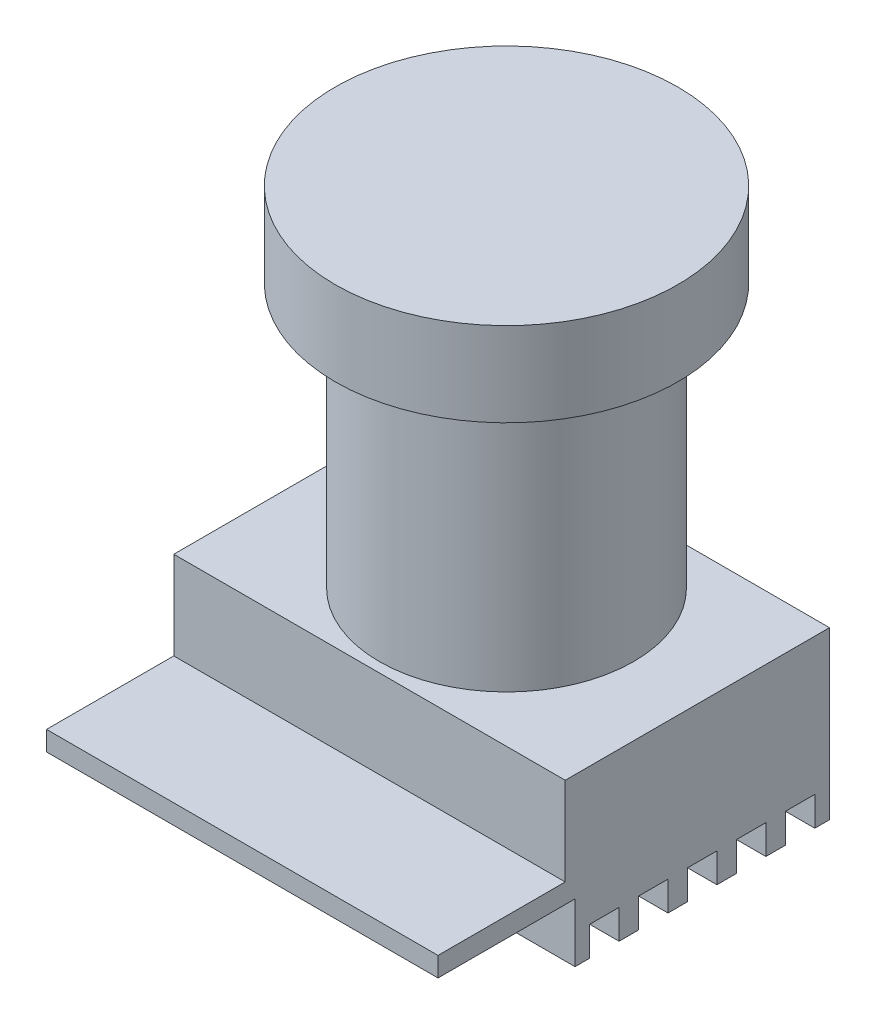
ISO-10303-21;
HEADER;
FILE_DESCRIPTION(('STEP AP214'),'2;1');
FILE_NAME('part.step','',(''),(''),'','','');
FILE_SCHEMA(('AUTOMOTIVE_DESIGN { 1 0 10303 214 1 1 1 1 }'));
ENDSEC;
DATA;
#1=APPLICATION_CONTEXT('core data for automotive mechanical design processes');
#2=APPLICATION_PROTOCOL_DEFINITION('international standard','automotive_design',2000,#1);
#3=PRODUCT_CONTEXT('',#1,'mechanical');
#4=PRODUCT('Part','Part','',(#3));
#5=PRODUCT_RELATED_PRODUCT_CATEGORY('part','',(#4));
#6=PRODUCT_DEFINITION_FORMATION('','',#4);
#7=PRODUCT_DEFINITION_CONTEXT('part definition',#1,'design');
#8=PRODUCT_DEFINITION('design','',#6,#7);
#9=PRODUCT_DEFINITION_SHAPE('','',#8);
#10=(LENGTH_UNIT() NAMED_UNIT(*) SI_UNIT(.MILLI.,.METRE.));
#11=(NAMED_UNIT(*) PLANE_ANGLE_UNIT() SI_UNIT($,.RADIAN.));
#12=(NAMED_UNIT(*) SI_UNIT($,.STERADIAN.) SOLID_ANGLE_UNIT());
#13=UNCERTAINTY_MEASURE_WITH_UNIT(LENGTH_MEASURE(1.E-05),#10,'distance_accuracy_value','');
#14=(GEOMETRIC_REPRESENTATION_CONTEXT(3) GLOBAL_UNCERTAINTY_ASSIGNED_CONTEXT((#13)) GLOBAL_UNIT_ASSIGNED_CONTEXT((#10,
#11,#12)) REPRESENTATION_CONTEXT('',''));
#15=CARTESIAN_POINT('',(0.,0.,0.));
#16=DIRECTION('',(0.,0.,1.));
#17=DIRECTION('',(1.,0.,0.));
#18=AXIS2_PLACEMENT_3D('',#15,#16,#17);
#19=CARTESIAN_POINT('',(0.,-3.,0.));
#20=DIRECTION('',(0.,1.,0.));
#21=DIRECTION('',(0.,0.,1.));
#22=AXIS2_PLACEMENT_3D('',#19,#20,#21);
#23=PLANE('',#22);
#24=DIRECTION('',(0.,0.,1.));
#25=VECTOR('',#24,1.);
#26=CARTESIAN_POINT('',(10.,-3.,-10.));
#27=LINE('',#26,#25);
#28=CARTESIAN_POINT('',(10.,-3.00000000000003,-7.75));
#29=VERTEX_POINT('',#28);
#30=CARTESIAN_POINT('',(10.,-3.00000000000002,-6.75));
#31=VERTEX_POINT('',#30);
#32=EDGE_CURVE('E395',#29,#31,#27,.T.);
#33=ORIENTED_EDGE('',*,*,#32,.T.);
#34=DIRECTION('',(-1.,0.,0.));
#35=VECTOR('',#34,1.);
#36=CARTESIAN_POINT('',(10.,-3.00000000000002,-6.75));
#37=LINE('',#36,#35);
#38=CARTESIAN_POINT('',(-10.,-3.00000000000002,-6.75));
#39=VERTEX_POINT('',#38);
#40=EDGE_CURVE('E316',#31,#39,#37,.T.);
#41=ORIENTED_EDGE('',*,*,#40,.T.);
#42=DIRECTION('',(0.,0.,-1.));
#43=VECTOR('',#42,1.);
#44=CARTESIAN_POINT('',(-10.,-3.,-10.));
#45=LINE('',#44,#43);
#46=CARTESIAN_POINT('',(-10.,-3.,-7.75));
#47=VERTEX_POINT('',#46);
#48=EDGE_CURVE('E500',#39,#47,#45,.T.);
#49=ORIENTED_EDGE('',*,*,#48,.T.);
#50=DIRECTION('',(-1.,0.,0.));
#51=VECTOR('',#50,1.);
#52=CARTESIAN_POINT('',(10.,-3.00000000000003,-7.75));
#53=LINE('',#52,#51);
#54=EDGE_CURVE('E56',#29,#47,#53,.T.);
#55=ORIENTED_EDGE('',*,*,#54,.F.);
#56=EDGE_LOOP('',(#33,#41,#49,#55));
#57=FACE_BOUND('',#56,.T.);
#58=ADVANCED_FACE('F33',(#57),#23,.F.);
#59=CARTESIAN_POINT('',(10.,-3.,-10.));
#60=VERTEX_POINT('',#59);
#61=CARTESIAN_POINT('',(10.,-3.00000000000003,-9.25));
#62=VERTEX_POINT('',#61);
#63=EDGE_CURVE('E391',#60,#62,#27,.T.);
#64=ORIENTED_EDGE('',*,*,#63,.T.);
#65=DIRECTION('',(-1.,0.,0.));
#66=VECTOR('',#65,1.);
#67=CARTESIAN_POINT('',(10.,-3.00000000000003,-9.25));
#68=LINE('',#67,#66);
#69=CARTESIAN_POINT('',(-10.,-3.00000000000003,-9.25));
#70=VERTEX_POINT('',#69);
#71=EDGE_CURVE('E342',#62,#70,#68,.T.);
#72=ORIENTED_EDGE('',*,*,#71,.T.);
#73=CARTESIAN_POINT('',(-10.,-3.,-10.));
#74=VERTEX_POINT('',#73);
#75=EDGE_CURVE('E386',#70,#74,#45,.T.);
#76=ORIENTED_EDGE('',*,*,#75,.T.);
#77=DIRECTION('',(1.,0.,0.));
#78=VECTOR('',#77,1.);
#79=CARTESIAN_POINT('',(-10.,-3.,-10.));
#80=LINE('',#79,#78);
#81=EDGE_CURVE('E384',#74,#60,#80,.T.);
#82=ORIENTED_EDGE('',*,*,#81,.T.);
#83=EDGE_LOOP('',(#64,#72,#76,#82));
#84=FACE_BOUND('',#83,.T.);
#85=ADVANCED_FACE('F433',(#84),#23,.F.);
#86=CARTESIAN_POINT('',(10.,-3.,-2.75));
#87=VERTEX_POINT('',#86);
#88=CARTESIAN_POINT('',(10.,-2.99999999999996,-1.75));
#89=VERTEX_POINT('',#88);
#90=EDGE_CURVE('E397',#87,#89,#27,.T.);
#91=ORIENTED_EDGE('',*,*,#90,.T.);
#92=DIRECTION('',(-1.,0.,0.));
#93=VECTOR('',#92,1.);
#94=CARTESIAN_POINT('',(10.,-2.99999999999996,-1.75));
#95=LINE('',#94,#93);
#96=CARTESIAN_POINT('',(-10.,-2.99999999999996,-1.75));
#97=VERTEX_POINT('',#96);
#98=EDGE_CURVE('E262',#89,#97,#95,.T.);
#99=ORIENTED_EDGE('',*,*,#98,.T.);
#100=CARTESIAN_POINT('',(-10.,-3.,-2.75));
#101=VERTEX_POINT('',#100);
#102=EDGE_CURVE('E499',#97,#101,#45,.T.);
#103=ORIENTED_EDGE('',*,*,#102,.T.);
#104=DIRECTION('',(-1.,0.,0.));
#105=VECTOR('',#104,1.);
#106=CARTESIAN_POINT('',(10.,-3.,-2.75));
#107=LINE('',#106,#105);
#108=EDGE_CURVE('E376',#87,#101,#107,.T.);
#109=ORIENTED_EDGE('',*,*,#108,.F.);
#110=EDGE_LOOP('',(#91,#99,#103,#109));
#111=FACE_BOUND('',#110,.T.);
#112=ADVANCED_FACE('F464',(#111),#23,.F.);
#113=CARTESIAN_POINT('',(-10.,-2.99999999999993,0.750000000000002));
#114=VERTEX_POINT('',#113);
#115=CARTESIAN_POINT('',(-10.,-2.99999999999996,-0.249999999999998));
#116=VERTEX_POINT('',#115);
#117=EDGE_CURVE('E385',#114,#116,#45,.T.);
#118=ORIENTED_EDGE('',*,*,#117,.T.);
#119=DIRECTION('',(-1.,0.,0.));
#120=VECTOR('',#119,1.);
#121=CARTESIAN_POINT('',(10.,-2.99999999999996,-0.25));
#122=LINE('',#121,#120);
#123=CARTESIAN_POINT('',(10.,-3.,-0.250000000000004));
#124=VERTEX_POINT('',#123);
#125=EDGE_CURVE('E276',#124,#116,#122,.T.);
#126=ORIENTED_EDGE('',*,*,#125,.F.);
#127=CARTESIAN_POINT('',(10.,-2.99999999999993,0.75));
#128=VERTEX_POINT('',#127);
#129=EDGE_CURVE('E514',#124,#128,#27,.T.);
#130=ORIENTED_EDGE('',*,*,#129,.T.);
#131=DIRECTION('',(-1.,0.,0.));
#132=VECTOR('',#131,1.);
#133=CARTESIAN_POINT('',(10.,-2.99999999999993,0.75));
#134=LINE('',#133,#132);
#135=EDGE_CURVE('E290',#128,#114,#134,.T.);
#136=ORIENTED_EDGE('',*,*,#135,.T.);
#137=EDGE_LOOP('',(#118,#126,#130,#136));
#138=FACE_BOUND('',#137,.T.);
#139=ADVANCED_FACE('F483',(#138),#23,.F.);
#140=CARTESIAN_POINT('',(-10.,-3.,-4.25));
#141=VERTEX_POINT('',#140);
#142=CARTESIAN_POINT('',(-10.,-3.,-5.25));
#143=VERTEX_POINT('',#142);
#144=EDGE_CURVE('E387',#141,#143,#45,.T.);
#145=ORIENTED_EDGE('',*,*,#144,.T.);
#146=DIRECTION('',(-1.,0.,0.));
#147=VECTOR('',#146,1.);
#148=CARTESIAN_POINT('',(10.,-3.00000000000002,-5.25));
#149=LINE('',#148,#147);
#150=CARTESIAN_POINT('',(10.,-3.00000000000002,-5.25));
#151=VERTEX_POINT('',#150);
#152=EDGE_CURVE('E328',#151,#143,#149,.T.);
#153=ORIENTED_EDGE('',*,*,#152,.F.);
#154=CARTESIAN_POINT('',(10.,-3.,-4.25));
#155=VERTEX_POINT('',#154);
#156=EDGE_CURVE('E396',#151,#155,#27,.T.);
#157=ORIENTED_EDGE('',*,*,#156,.T.);
#158=DIRECTION('',(-1.,0.,0.));
#159=VECTOR('',#158,1.);
#160=CARTESIAN_POINT('',(10.,-3.,-4.25));
#161=LINE('',#160,#159);
#162=EDGE_CURVE('E364',#155,#141,#161,.T.);
#163=ORIENTED_EDGE('',*,*,#162,.T.);
#164=EDGE_LOOP('',(#145,#153,#157,#163));
#165=FACE_BOUND('',#164,.T.);
#166=ADVANCED_FACE('F472',(#165),#23,.F.);
#167=CARTESIAN_POINT('',(0.,0.,0.));
#168=DIRECTION('',(0.,1.,0.));
#169=DIRECTION('',(0.,0.,1.));
#170=AXIS2_PLACEMENT_3D('',#167,#168,#169);
#171=PLANE('',#170);
#172=DIRECTION('',(-1.,0.,0.));
#173=VECTOR('',#172,1.);
#174=CARTESIAN_POINT('',(-10.,0.,3.));
#175=LINE('',#174,#173);
#176=CARTESIAN_POINT('',(10.,0.,3.));
#177=VERTEX_POINT('',#176);
#178=CARTESIAN_POINT('',(-10.,0.,3.));
#179=VERTEX_POINT('',#178);
#180=EDGE_CURVE('E373',#177,#179,#175,.T.);
#181=ORIENTED_EDGE('',*,*,#180,.F.);
#182=DIRECTION('',(0.,0.,-1.));
#183=VECTOR('',#182,1.);
#184=CARTESIAN_POINT('',(10.,0.,-10.));
#185=LINE('',#184,#183);
#186=CARTESIAN_POINT('',(10.,0.,10.));
#187=VERTEX_POINT('',#186);
#188=EDGE_CURVE('E407',#187,#177,#185,.T.);
#189=ORIENTED_EDGE('',*,*,#188,.F.);
#190=DIRECTION('',(1.,0.,0.));
#191=VECTOR('',#190,1.);
#192=CARTESIAN_POINT('',(-10.,0.,10.));
#193=LINE('',#192,#191);
#194=CARTESIAN_POINT('',(-10.,0.,10.));
#195=VERTEX_POINT('',#194);
#196=EDGE_CURVE('E411',#195,#187,#193,.T.);
#197=ORIENTED_EDGE('',*,*,#196,.F.);
#198=DIRECTION('',(0.,0.,1.));
#199=VECTOR('',#198,1.);
#200=CARTESIAN_POINT('',(-10.,0.,-10.));
#201=LINE('',#200,#199);
#202=EDGE_CURVE('E418',#179,#195,#201,.T.);
#203=ORIENTED_EDGE('',*,*,#202,.F.);
#204=EDGE_LOOP('',(#181,#189,#197,#203));
#205=FACE_BOUND('',#204,.T.);
#206=ADVANCED_FACE('F482',(#205),#171,.F.);
#207=CARTESIAN_POINT('',(10.,1.,-10.));
#208=DIRECTION('',(-1.,0.,0.));
#209=DIRECTION('',(0.,0.,1.));
#210=AXIS2_PLACEMENT_3D('',#207,#208,#209);
#211=PLANE('',#210);
#212=DIRECTION('',(0.,0.,-1.));
#213=VECTOR('',#212,1.);
#214=CARTESIAN_POINT('',(10.,-1.49999999999996,-1.75));
#215=LINE('',#214,#213);
#216=CARTESIAN_POINT('',(10.,-1.49999999999996,-0.25));
#217=VERTEX_POINT('',#216);
#218=CARTESIAN_POINT('',(10.,-1.49999999999996,-1.75));
#219=VERTEX_POINT('',#218);
#220=EDGE_CURVE('E259',#217,#219,#215,.T.);
#221=ORIENTED_EDGE('',*,*,#220,.T.);
#222=DIRECTION('',(0.,-1.,0.));
#223=VECTOR('',#222,1.);
#224=CARTESIAN_POINT('',(10.,-2.99999999999996,-1.75));
#225=LINE('',#224,#223);
#226=EDGE_CURVE('E252',#219,#89,#225,.T.);
#227=ORIENTED_EDGE('',*,*,#226,.T.);
#228=ORIENTED_EDGE('',*,*,#90,.F.);
#229=DIRECTION('',(0.,1.,0.));
#230=VECTOR('',#229,1.);
#231=CARTESIAN_POINT('',(10.,-3.,-2.75));
#232=LINE('',#231,#230);
#233=CARTESIAN_POINT('',(10.,-1.5,-2.75));
#234=VERTEX_POINT('',#233);
#235=EDGE_CURVE('E357',#87,#234,#232,.T.);
#236=ORIENTED_EDGE('',*,*,#235,.T.);
#237=DIRECTION('',(0.,0.,-1.));
#238=VECTOR('',#237,1.);
#239=CARTESIAN_POINT('',(10.,-1.5,-4.25));
#240=LINE('',#239,#238);
#241=CARTESIAN_POINT('',(10.,-1.5,-4.25));
#242=VERTEX_POINT('',#241);
#243=EDGE_CURVE('E361',#234,#242,#240,.T.);
#244=ORIENTED_EDGE('',*,*,#243,.T.);
#245=DIRECTION('',(0.,-1.,0.));
#246=VECTOR('',#245,1.);
#247=CARTESIAN_POINT('',(10.,-3.,-4.25));
#248=LINE('',#247,#246);
#249=EDGE_CURVE('E354',#242,#155,#248,.T.);
#250=ORIENTED_EDGE('',*,*,#249,.T.);
#251=ORIENTED_EDGE('',*,*,#156,.F.);
#252=DIRECTION('',(0.,1.,0.));
#253=VECTOR('',#252,1.);
#254=CARTESIAN_POINT('',(10.,-3.00000000000002,-5.25));
#255=LINE('',#254,#253);
#256=CARTESIAN_POINT('',(10.,-1.50000000000002,-5.25));
#257=VERTEX_POINT('',#256);
#258=EDGE_CURVE('E309',#151,#257,#255,.T.);
#259=ORIENTED_EDGE('',*,*,#258,.T.);
#260=DIRECTION('',(0.,0.,-1.));
#261=VECTOR('',#260,1.);
#262=CARTESIAN_POINT('',(10.,-1.50000000000002,-6.75));
#263=LINE('',#262,#261);
#264=CARTESIAN_POINT('',(10.,-1.50000000000002,-6.75));
#265=VERTEX_POINT('',#264);
#266=EDGE_CURVE('E313',#257,#265,#263,.T.);
#267=ORIENTED_EDGE('',*,*,#266,.T.);
#268=DIRECTION('',(0.,-1.,0.));
#269=VECTOR('',#268,1.);
#270=CARTESIAN_POINT('',(10.,-3.00000000000002,-6.75));
#271=LINE('',#270,#269);
#272=EDGE_CURVE('E306',#265,#31,#271,.T.);
#273=ORIENTED_EDGE('',*,*,#272,.T.);
#274=ORIENTED_EDGE('',*,*,#32,.F.);
#275=DIRECTION('',(0.,1.,0.));
#276=VECTOR('',#275,1.);
#277=CARTESIAN_POINT('',(10.,-3.00000000000003,-7.75));
#278=LINE('',#277,#276);
#279=CARTESIAN_POINT('',(10.,-1.50000000000003,-7.75));
#280=VERTEX_POINT('',#279);
#281=EDGE_CURVE('E335',#29,#280,#278,.T.);
#282=ORIENTED_EDGE('',*,*,#281,.T.);
#283=DIRECTION('',(0.,0.,-1.));
#284=VECTOR('',#283,1.);
#285=CARTESIAN_POINT('',(10.,-1.50000000000003,-9.25));
#286=LINE('',#285,#284);
#287=CARTESIAN_POINT('',(10.,-1.50000000000003,-9.25));
#288=VERTEX_POINT('',#287);
#289=EDGE_CURVE('E339',#280,#288,#286,.T.);
#290=ORIENTED_EDGE('',*,*,#289,.T.);
#291=DIRECTION('',(0.,-1.,0.));
#292=VECTOR('',#291,1.);
#293=CARTESIAN_POINT('',(10.,-3.00000000000003,-9.25));
#294=LINE('',#293,#292);
#295=EDGE_CURVE('E332',#288,#62,#294,.T.);
#296=ORIENTED_EDGE('',*,*,#295,.T.);
#297=ORIENTED_EDGE('',*,*,#63,.F.);
#298=DIRECTION('',(0.,-1.,0.));
#299=VECTOR('',#298,1.);
#300=CARTESIAN_POINT('',(10.,1.,-10.));
#301=LINE('',#300,#299);
#302=CARTESIAN_POINT('',(10.,5.5,-10.));
#303=VERTEX_POINT('',#302);
#304=EDGE_CURVE('E11',#303,#60,#301,.T.);
#305=ORIENTED_EDGE('',*,*,#304,.F.);
#306=DIRECTION('',(0.,0.,-1.));
#307=VECTOR('',#306,1.);
#308=CARTESIAN_POINT('',(10.,5.5,-10.));
#309=LINE('',#308,#307);
#310=CARTESIAN_POINT('',(10.,5.5,3.5));
#311=VERTEX_POINT('',#310);
#312=EDGE_CURVE('E228',#311,#303,#309,.T.);
#313=ORIENTED_EDGE('',*,*,#312,.F.);
#314=DIRECTION('',(0.,-1.,0.));
#315=VECTOR('',#314,1.);
#316=CARTESIAN_POINT('',(10.,5.5,3.5));
#317=LINE('',#316,#315);
#318=CARTESIAN_POINT('',(10.,1.,3.5));
#319=VERTEX_POINT('',#318);
#320=EDGE_CURVE('E230',#311,#319,#317,.T.);
#321=ORIENTED_EDGE('',*,*,#320,.T.);
#322=DIRECTION('',(0.,0.,-1.));
#323=VECTOR('',#322,1.);
#324=CARTESIAN_POINT('',(10.,1.,-10.));
#325=LINE('',#324,#323);
#326=CARTESIAN_POINT('',(10.,1.,10.));
#327=VERTEX_POINT('',#326);
#328=EDGE_CURVE('E408',#327,#319,#325,.T.);
#329=ORIENTED_EDGE('',*,*,#328,.F.);
#330=DIRECTION('',(0.,-1.,0.));
#331=VECTOR('',#330,1.);
#332=CARTESIAN_POINT('',(10.,1.,10.));
#333=LINE('',#332,#331);
#334=EDGE_CURVE('E415',#327,#187,#333,.T.);
#335=ORIENTED_EDGE('',*,*,#334,.T.);
#336=ORIENTED_EDGE('',*,*,#188,.T.);
#337=DIRECTION('',(0.,1.,0.));
#338=VECTOR('',#337,1.);
#339=CARTESIAN_POINT('',(10.,-3.,3.));
#340=LINE('',#339,#338);
#341=CARTESIAN_POINT('',(10.,-3.,3.));
#342=VERTEX_POINT('',#341);
#343=EDGE_CURVE('E404',#342,#177,#340,.T.);
#344=ORIENTED_EDGE('',*,*,#343,.F.);
#345=CARTESIAN_POINT('',(10.,-3.,2.25));
#346=VERTEX_POINT('',#345);
#347=EDGE_CURVE('E390',#346,#342,#27,.T.);
#348=ORIENTED_EDGE('',*,*,#347,.F.);
#349=DIRECTION('',(0.,1.,0.));
#350=VECTOR('',#349,1.);
#351=CARTESIAN_POINT('',(10.,-2.99999999999993,2.25));
#352=LINE('',#351,#350);
#353=CARTESIAN_POINT('',(10.,-1.49999999999993,2.25));
#354=VERTEX_POINT('',#353);
#355=EDGE_CURVE('E283',#346,#354,#352,.T.);
#356=ORIENTED_EDGE('',*,*,#355,.T.);
#357=DIRECTION('',(0.,0.,-1.));
#358=VECTOR('',#357,1.);
#359=CARTESIAN_POINT('',(10.,-1.49999999999993,0.75));
#360=LINE('',#359,#358);
#361=CARTESIAN_POINT('',(10.,-1.49999999999993,0.75));
#362=VERTEX_POINT('',#361);
#363=EDGE_CURVE('E287',#354,#362,#360,.T.);
#364=ORIENTED_EDGE('',*,*,#363,.T.);
#365=DIRECTION('',(0.,-1.,0.));
#366=VECTOR('',#365,1.);
#367=CARTESIAN_POINT('',(10.,-2.99999999999993,0.75));
#368=LINE('',#367,#366);
#369=EDGE_CURVE('E280',#362,#128,#368,.T.);
#370=ORIENTED_EDGE('',*,*,#369,.T.);
#371=ORIENTED_EDGE('',*,*,#129,.F.);
#372=DIRECTION('',(0.,1.,0.));
#373=VECTOR('',#372,1.);
#374=CARTESIAN_POINT('',(10.,-2.99999999999996,-0.25));
#375=LINE('',#374,#373);
#376=EDGE_CURVE('E255',#124,#217,#375,.T.);
#377=ORIENTED_EDGE('',*,*,#376,.T.);
#378=EDGE_LOOP('',(#221,#227,#228,#236,#244,#250,#251,#259,#267,#273,#274,#282,#290,#296,#297,
#305,#313,#321,#329,#335,#336,#344,#348,#356,#364,#370,#371,#377));
#379=FACE_BOUND('',#378,.T.);
#380=ADVANCED_FACE('F35',(#379),#211,.F.);
#381=CARTESIAN_POINT('',(-10.,1.,-10.));
#382=DIRECTION('',(0.,0.,1.));
#383=DIRECTION('',(1.,0.,0.));
#384=AXIS2_PLACEMENT_3D('',#381,#382,#383);
#385=PLANE('',#384);
#386=ORIENTED_EDGE('',*,*,#304,.T.);
#387=ORIENTED_EDGE('',*,*,#81,.F.);
#388=DIRECTION('',(0.,-1.,0.));
#389=VECTOR('',#388,1.);
#390=CARTESIAN_POINT('',(-10.,1.,-10.));
#391=LINE('',#390,#389);
#392=CARTESIAN_POINT('',(-10.,5.5,-10.));
#393=VERTEX_POINT('',#392);
#394=EDGE_CURVE('E41',#393,#74,#391,.T.);
#395=ORIENTED_EDGE('',*,*,#394,.F.);
#396=DIRECTION('',(-1.,0.,0.));
#397=VECTOR('',#396,1.);
#398=CARTESIAN_POINT('',(-10.,5.5,-10.));
#399=LINE('',#398,#397);
#400=CARTESIAN_POINT('',(0.,5.5,-10.));
#401=VERTEX_POINT('',#400);
#402=EDGE_CURVE('E231',#401,#393,#399,.T.);
#403=ORIENTED_EDGE('',*,*,#402,.F.);
#404=EDGE_CURVE('E222',#303,#401,#399,.T.);
#405=ORIENTED_EDGE('',*,*,#404,.F.);
#406=EDGE_LOOP('',(#386,#387,#395,#403,#405));
#407=FACE_BOUND('',#406,.T.);
#408=ADVANCED_FACE('F234',(#407),#385,.F.);
#409=CARTESIAN_POINT('',(-10.,1.,-10.));
#410=DIRECTION('',(1.,0.,0.));
#411=DIRECTION('',(0.,0.,-1.));
#412=AXIS2_PLACEMENT_3D('',#409,#410,#411);
#413=PLANE('',#412);
#414=ORIENTED_EDGE('',*,*,#102,.F.);
#415=DIRECTION('',(0.,-1.,0.));
#416=VECTOR('',#415,1.);
#417=CARTESIAN_POINT('',(-10.,-2.99999999999996,-1.75));
#418=LINE('',#417,#416);
#419=CARTESIAN_POINT('',(-10.,-1.49999999999996,-1.75));
#420=VERTEX_POINT('',#419);
#421=EDGE_CURVE('E263',#420,#97,#418,.T.);
#422=ORIENTED_EDGE('',*,*,#421,.F.);
#423=DIRECTION('',(0.,0.,-1.));
#424=VECTOR('',#423,1.);
#425=CARTESIAN_POINT('',(-10.,-1.49999999999996,-1.75));
#426=LINE('',#425,#424);
#427=CARTESIAN_POINT('',(-10.,-1.49999999999996,-0.249999999999998));
#428=VERTEX_POINT('',#427);
#429=EDGE_CURVE('E256',#428,#420,#426,.T.);
#430=ORIENTED_EDGE('',*,*,#429,.F.);
#431=DIRECTION('',(0.,1.,0.));
#432=VECTOR('',#431,1.);
#433=CARTESIAN_POINT('',(-10.,-2.99999999999996,-0.249999999999998));
#434=LINE('',#433,#432);
#435=EDGE_CURVE('E265',#116,#428,#434,.T.);
#436=ORIENTED_EDGE('',*,*,#435,.F.);
#437=ORIENTED_EDGE('',*,*,#117,.F.);
#438=DIRECTION('',(0.,-1.,0.));
#439=VECTOR('',#438,1.);
#440=CARTESIAN_POINT('',(-10.,-2.99999999999993,0.750000000000002));
#441=LINE('',#440,#439);
#442=CARTESIAN_POINT('',(-10.,-1.49999999999993,0.750000000000002));
#443=VERTEX_POINT('',#442);
#444=EDGE_CURVE('E291',#443,#114,#441,.T.);
#445=ORIENTED_EDGE('',*,*,#444,.F.);
#446=DIRECTION('',(0.,0.,-1.));
#447=VECTOR('',#446,1.);
#448=CARTESIAN_POINT('',(-10.,-1.49999999999993,0.750000000000002));
#449=LINE('',#448,#447);
#450=CARTESIAN_POINT('',(-10.,-1.49999999999993,2.25));
#451=VERTEX_POINT('',#450);
#452=EDGE_CURVE('E284',#451,#443,#449,.T.);
#453=ORIENTED_EDGE('',*,*,#452,.F.);
#454=DIRECTION('',(0.,1.,0.));
#455=VECTOR('',#454,1.);
#456=CARTESIAN_POINT('',(-10.,-2.99999999999993,2.25));
#457=LINE('',#456,#455);
#458=CARTESIAN_POINT('',(-10.,-2.99999999999993,2.25));
#459=VERTEX_POINT('',#458);
#460=EDGE_CURVE('E293',#459,#451,#457,.T.);
#461=ORIENTED_EDGE('',*,*,#460,.F.);
#462=CARTESIAN_POINT('',(-10.,-3.,3.));
#463=VERTEX_POINT('',#462);
#464=EDGE_CURVE('E381',#463,#459,#45,.T.);
#465=ORIENTED_EDGE('',*,*,#464,.F.);
#466=DIRECTION('',(0.,1.,0.));
#467=VECTOR('',#466,1.);
#468=CARTESIAN_POINT('',(-10.,-3.,3.));
#469=LINE('',#468,#467);
#470=EDGE_CURVE('E399',#463,#179,#469,.T.);
#471=ORIENTED_EDGE('',*,*,#470,.T.);
#472=ORIENTED_EDGE('',*,*,#202,.T.);
#473=DIRECTION('',(0.,-1.,0.));
#474=VECTOR('',#473,1.);
#475=CARTESIAN_POINT('',(-10.,1.,10.));
#476=LINE('',#475,#474);
#477=CARTESIAN_POINT('',(-10.,1.,10.));
#478=VERTEX_POINT('',#477);
#479=EDGE_CURVE('E423',#478,#195,#476,.T.);
#480=ORIENTED_EDGE('',*,*,#479,.F.);
#481=DIRECTION('',(0.,0.,1.));
#482=VECTOR('',#481,1.);
#483=CARTESIAN_POINT('',(-10.,1.,-10.));
#484=LINE('',#483,#482);
#485=CARTESIAN_POINT('',(-10.,1.,3.5));
#486=VERTEX_POINT('',#485);
#487=EDGE_CURVE('E410',#486,#478,#484,.T.);
#488=ORIENTED_EDGE('',*,*,#487,.F.);
#489=DIRECTION('',(0.,-1.,0.));
#490=VECTOR('',#489,1.);
#491=CARTESIAN_POINT('',(-9.99999999999999,5.5,3.5));
#492=LINE('',#491,#490);
#493=CARTESIAN_POINT('',(-9.99999999999999,5.5,3.5));
#494=VERTEX_POINT('',#493);
#495=EDGE_CURVE('E248',#494,#486,#492,.T.);
#496=ORIENTED_EDGE('',*,*,#495,.F.);
#497=DIRECTION('',(0.,0.,1.));
#498=VECTOR('',#497,1.);
#499=CARTESIAN_POINT('',(-10.,5.5,-10.));
#500=LINE('',#499,#498);
#501=EDGE_CURVE('E244',#393,#494,#500,.T.);
#502=ORIENTED_EDGE('',*,*,#501,.F.);
#503=ORIENTED_EDGE('',*,*,#394,.T.);
#504=ORIENTED_EDGE('',*,*,#75,.F.);
#505=DIRECTION('',(0.,-1.,0.));
#506=VECTOR('',#505,1.);
#507=CARTESIAN_POINT('',(-10.,-3.00000000000003,-9.25));
#508=LINE('',#507,#506);
#509=CARTESIAN_POINT('',(-10.,-1.50000000000003,-9.25));
#510=VERTEX_POINT('',#509);
#511=EDGE_CURVE('E251',#510,#70,#508,.T.);
#512=ORIENTED_EDGE('',*,*,#511,.F.);
#513=DIRECTION('',(0.,0.,-1.));
#514=VECTOR('',#513,1.);
#515=CARTESIAN_POINT('',(-10.,-1.50000000000003,-9.25));
#516=LINE('',#515,#514);
#517=CARTESIAN_POINT('',(-10.,-1.50000000000003,-7.75));
#518=VERTEX_POINT('',#517);
#519=EDGE_CURVE('E336',#518,#510,#516,.T.);
#520=ORIENTED_EDGE('',*,*,#519,.F.);
#521=DIRECTION('',(0.,1.,0.));
#522=VECTOR('',#521,1.);
#523=CARTESIAN_POINT('',(-10.,-3.00000000000003,-7.75));
#524=LINE('',#523,#522);
#525=EDGE_CURVE('E344',#47,#518,#524,.T.);
#526=ORIENTED_EDGE('',*,*,#525,.F.);
#527=ORIENTED_EDGE('',*,*,#48,.F.);
#528=DIRECTION('',(0.,-1.,0.));
#529=VECTOR('',#528,1.);
#530=CARTESIAN_POINT('',(-10.,-3.00000000000002,-6.75));
#531=LINE('',#530,#529);
#532=CARTESIAN_POINT('',(-10.,-1.50000000000002,-6.75));
#533=VERTEX_POINT('',#532);
#534=EDGE_CURVE('E317',#533,#39,#531,.T.);
#535=ORIENTED_EDGE('',*,*,#534,.F.);
#536=DIRECTION('',(0.,0.,-1.));
#537=VECTOR('',#536,1.);
#538=CARTESIAN_POINT('',(-10.,-1.50000000000002,-6.75));
#539=LINE('',#538,#537);
#540=CARTESIAN_POINT('',(-10.,-1.50000000000002,-5.25));
#541=VERTEX_POINT('',#540);
#542=EDGE_CURVE('E310',#541,#533,#539,.T.);
#543=ORIENTED_EDGE('',*,*,#542,.F.);
#544=DIRECTION('',(0.,1.,0.));
#545=VECTOR('',#544,1.);
#546=CARTESIAN_POINT('',(-10.,-3.00000000000002,-5.25));
#547=LINE('',#546,#545);
#548=EDGE_CURVE('E319',#143,#541,#547,.T.);
#549=ORIENTED_EDGE('',*,*,#548,.F.);
#550=ORIENTED_EDGE('',*,*,#144,.F.);
#551=DIRECTION('',(0.,-1.,0.));
#552=VECTOR('',#551,1.);
#553=CARTESIAN_POINT('',(-10.,-3.,-4.25));
#554=LINE('',#553,#552);
#555=CARTESIAN_POINT('',(-10.,-1.5,-4.25));
#556=VERTEX_POINT('',#555);
#557=EDGE_CURVE('E273',#556,#141,#554,.T.);
#558=ORIENTED_EDGE('',*,*,#557,.F.);
#559=DIRECTION('',(0.,0.,-1.));
#560=VECTOR('',#559,1.);
#561=CARTESIAN_POINT('',(-10.,-1.5,-4.25));
#562=LINE('',#561,#560);
#563=CARTESIAN_POINT('',(-10.,-1.5,-2.75));
#564=VERTEX_POINT('',#563);
#565=EDGE_CURVE('E358',#564,#556,#562,.T.);
#566=ORIENTED_EDGE('',*,*,#565,.F.);
#567=DIRECTION('',(0.,1.,0.));
#568=VECTOR('',#567,1.);
#569=CARTESIAN_POINT('',(-10.,-3.,-2.75));
#570=LINE('',#569,#568);
#571=EDGE_CURVE('E366',#101,#564,#570,.T.);
#572=ORIENTED_EDGE('',*,*,#571,.F.);
#573=EDGE_LOOP('',(#414,#422,#430,#436,#437,#445,#453,#461,#465,#471,#472,#480,#488,#496,#502,
#503,#504,#512,#520,#526,#527,#535,#543,#549,#550,#558,#566,#572));
#574=FACE_BOUND('',#573,.T.);
#575=ADVANCED_FACE('F428',(#574),#413,.F.);
#576=CARTESIAN_POINT('',(-10.,1.,10.));
#577=DIRECTION('',(0.,0.,-1.));
#578=DIRECTION('',(-1.,0.,0.));
#579=AXIS2_PLACEMENT_3D('',#576,#577,#578);
#580=PLANE('',#579);
#581=ORIENTED_EDGE('',*,*,#196,.T.);
#582=ORIENTED_EDGE('',*,*,#334,.F.);
#583=DIRECTION('',(1.,0.,0.));
#584=VECTOR('',#583,1.);
#585=CARTESIAN_POINT('',(-10.,1.,10.));
#586=LINE('',#585,#584);
#587=EDGE_CURVE('E413',#478,#327,#586,.T.);
#588=ORIENTED_EDGE('',*,*,#587,.F.);
#589=ORIENTED_EDGE('',*,*,#479,.T.);
#590=EDGE_LOOP('',(#581,#582,#588,#589));
#591=FACE_BOUND('',#590,.T.);
#592=ADVANCED_FACE('F585',(#591),#580,.F.);
#593=CARTESIAN_POINT('',(0.,1.,0.));
#594=DIRECTION('',(0.,1.,0.));
#595=DIRECTION('',(0.,0.,1.));
#596=AXIS2_PLACEMENT_3D('',#593,#594,#595);
#597=PLANE('',#596);
#598=DIRECTION('',(1.,0.,0.));
#599=VECTOR('',#598,1.);
#600=CARTESIAN_POINT('',(-9.99999999999999,1.,3.5));
#601=LINE('',#600,#599);
#602=EDGE_CURVE('E48',#486,#319,#601,.T.);
#603=ORIENTED_EDGE('',*,*,#602,.F.);
#604=ORIENTED_EDGE('',*,*,#487,.T.);
#605=ORIENTED_EDGE('',*,*,#587,.T.);
#606=ORIENTED_EDGE('',*,*,#328,.T.);
#607=EDGE_LOOP('',(#603,#604,#605,#606));
#608=FACE_BOUND('',#607,.T.);
#609=ADVANCED_FACE('F479',(#608),#597,.T.);
#610=CARTESIAN_POINT('',(-10.,-3.,3.));
#611=DIRECTION('',(0.,0.,-1.));
#612=DIRECTION('',(-1.,0.,0.));
#613=AXIS2_PLACEMENT_3D('',#610,#611,#612);
#614=PLANE('',#613);
#615=ORIENTED_EDGE('',*,*,#180,.T.);
#616=ORIENTED_EDGE('',*,*,#470,.F.);
#617=DIRECTION('',(-1.,0.,0.));
#618=VECTOR('',#617,1.);
#619=CARTESIAN_POINT('',(-10.,-3.,3.));
#620=LINE('',#619,#618);
#621=EDGE_CURVE('E394',#342,#463,#620,.T.);
#622=ORIENTED_EDGE('',*,*,#621,.F.);
#623=ORIENTED_EDGE('',*,*,#343,.T.);
#624=EDGE_LOOP('',(#615,#616,#622,#623));
#625=FACE_BOUND('',#624,.T.);
#626=ADVANCED_FACE('F470',(#625),#614,.F.);
#627=ORIENTED_EDGE('',*,*,#464,.T.);
#628=DIRECTION('',(-1.,0.,0.));
#629=VECTOR('',#628,1.);
#630=CARTESIAN_POINT('',(10.,-2.99999999999993,2.25));
#631=LINE('',#630,#629);
#632=EDGE_CURVE('E302',#346,#459,#631,.T.);
#633=ORIENTED_EDGE('',*,*,#632,.F.);
#634=ORIENTED_EDGE('',*,*,#347,.T.);
#635=ORIENTED_EDGE('',*,*,#621,.T.);
#636=EDGE_LOOP('',(#627,#633,#634,#635));
#637=FACE_BOUND('',#636,.T.);
#638=ADVANCED_FACE('F460',(#637),#23,.F.);
#639=CARTESIAN_POINT('',(10.,-3.,-4.25));
#640=DIRECTION('',(0.,0.,-1.));
#641=DIRECTION('',(-1.,0.,0.));
#642=AXIS2_PLACEMENT_3D('',#639,#640,#641);
#643=PLANE('',#642);
#644=ORIENTED_EDGE('',*,*,#557,.T.);
#645=ORIENTED_EDGE('',*,*,#162,.F.);
#646=ORIENTED_EDGE('',*,*,#249,.F.);
#647=DIRECTION('',(-1.,0.,0.));
#648=VECTOR('',#647,1.);
#649=CARTESIAN_POINT('',(10.,-1.5,-4.25));
#650=LINE('',#649,#648);
#651=EDGE_CURVE('E371',#242,#556,#650,.T.);
#652=ORIENTED_EDGE('',*,*,#651,.T.);
#653=EDGE_LOOP('',(#644,#645,#646,#652));
#654=FACE_BOUND('',#653,.T.);
#655=ADVANCED_FACE('F469',(#654),#643,.F.);
#656=CARTESIAN_POINT('',(10.,-1.5,-4.25));
#657=DIRECTION('',(0.,1.,0.));
#658=DIRECTION('',(0.,0.,1.));
#659=AXIS2_PLACEMENT_3D('',#656,#657,#658);
#660=PLANE('',#659);
#661=ORIENTED_EDGE('',*,*,#565,.T.);
#662=ORIENTED_EDGE('',*,*,#651,.F.);
#663=ORIENTED_EDGE('',*,*,#243,.F.);
#664=DIRECTION('',(-1.,0.,0.));
#665=VECTOR('',#664,1.);
#666=CARTESIAN_POINT('',(10.,-1.5,-2.75));
#667=LINE('',#666,#665);
#668=EDGE_CURVE('E374',#234,#564,#667,.T.);
#669=ORIENTED_EDGE('',*,*,#668,.T.);
#670=EDGE_LOOP('',(#661,#662,#663,#669));
#671=FACE_BOUND('',#670,.T.);
#672=ADVANCED_FACE('F477',(#671),#660,.F.);
#673=CARTESIAN_POINT('',(10.,-3.,-2.75));
#674=DIRECTION('',(0.,0.,1.));
#675=DIRECTION('',(1.,0.,0.));
#676=AXIS2_PLACEMENT_3D('',#673,#674,#675);
#677=PLANE('',#676);
#678=ORIENTED_EDGE('',*,*,#571,.T.);
#679=ORIENTED_EDGE('',*,*,#668,.F.);
#680=ORIENTED_EDGE('',*,*,#235,.F.);
#681=ORIENTED_EDGE('',*,*,#108,.T.);
#682=EDGE_LOOP('',(#678,#679,#680,#681));
#683=FACE_BOUND('',#682,.T.);
#684=ADVANCED_FACE('F528',(#683),#677,.F.);
#685=CARTESIAN_POINT('',(10.,-2.99999999999993,0.75));
#686=DIRECTION('',(0.,0.,-1.));
#687=DIRECTION('',(-1.,0.,0.));
#688=AXIS2_PLACEMENT_3D('',#685,#686,#687);
#689=PLANE('',#688);
#690=ORIENTED_EDGE('',*,*,#444,.T.);
#691=ORIENTED_EDGE('',*,*,#135,.F.);
#692=ORIENTED_EDGE('',*,*,#369,.F.);
#693=DIRECTION('',(-1.,0.,0.));
#694=VECTOR('',#693,1.);
#695=CARTESIAN_POINT('',(10.,-1.49999999999993,0.75));
#696=LINE('',#695,#694);
#697=EDGE_CURVE('E266',#362,#443,#696,.T.);
#698=ORIENTED_EDGE('',*,*,#697,.T.);
#699=EDGE_LOOP('',(#690,#691,#692,#698));
#700=FACE_BOUND('',#699,.T.);
#701=ADVANCED_FACE('F552',(#700),#689,.F.);
#702=CARTESIAN_POINT('',(10.,-1.49999999999993,0.75));
#703=DIRECTION('',(0.,1.,0.));
#704=DIRECTION('',(0.,0.,1.));
#705=AXIS2_PLACEMENT_3D('',#702,#703,#704);
#706=PLANE('',#705);
#707=ORIENTED_EDGE('',*,*,#452,.T.);
#708=ORIENTED_EDGE('',*,*,#697,.F.);
#709=ORIENTED_EDGE('',*,*,#363,.F.);
#710=DIRECTION('',(-1.,0.,0.));
#711=VECTOR('',#710,1.);
#712=CARTESIAN_POINT('',(10.,-1.49999999999993,2.25));
#713=LINE('',#712,#711);
#714=EDGE_CURVE('E300',#354,#451,#713,.T.);
#715=ORIENTED_EDGE('',*,*,#714,.T.);
#716=EDGE_LOOP('',(#707,#708,#709,#715));
#717=FACE_BOUND('',#716,.T.);
#718=ADVANCED_FACE('F549',(#717),#706,.F.);
#719=CARTESIAN_POINT('',(10.,-2.99999999999993,2.25));
#720=DIRECTION('',(0.,0.,1.));
#721=DIRECTION('',(1.,0.,0.));
#722=AXIS2_PLACEMENT_3D('',#719,#720,#721);
#723=PLANE('',#722);
#724=ORIENTED_EDGE('',*,*,#460,.T.);
#725=ORIENTED_EDGE('',*,*,#714,.F.);
#726=ORIENTED_EDGE('',*,*,#355,.F.);
#727=ORIENTED_EDGE('',*,*,#632,.T.);
#728=EDGE_LOOP('',(#724,#725,#726,#727));
#729=FACE_BOUND('',#728,.T.);
#730=ADVANCED_FACE('F543',(#729),#723,.F.);
#731=CARTESIAN_POINT('',(10.,-2.99999999999996,-1.75));
#732=DIRECTION('',(0.,0.,-1.));
#733=DIRECTION('',(-1.,0.,0.));
#734=AXIS2_PLACEMENT_3D('',#731,#732,#733);
#735=PLANE('',#734);
#736=ORIENTED_EDGE('',*,*,#421,.T.);
#737=ORIENTED_EDGE('',*,*,#98,.F.);
#738=ORIENTED_EDGE('',*,*,#226,.F.);
#739=DIRECTION('',(-1.,0.,0.));
#740=VECTOR('',#739,1.);
#741=CARTESIAN_POINT('',(10.,-1.49999999999996,-1.75));
#742=LINE('',#741,#740);
#743=EDGE_CURVE('E271',#219,#420,#742,.T.);
#744=ORIENTED_EDGE('',*,*,#743,.T.);
#745=EDGE_LOOP('',(#736,#737,#738,#744));
#746=FACE_BOUND('',#745,.T.);
#747=ADVANCED_FACE('F533',(#746),#735,.F.);
#748=CARTESIAN_POINT('',(10.,-1.49999999999996,-1.75));
#749=DIRECTION('',(0.,1.,0.));
#750=DIRECTION('',(0.,0.,1.));
#751=AXIS2_PLACEMENT_3D('',#748,#749,#750);
#752=PLANE('',#751);
#753=ORIENTED_EDGE('',*,*,#429,.T.);
#754=ORIENTED_EDGE('',*,*,#743,.F.);
#755=ORIENTED_EDGE('',*,*,#220,.F.);
#756=DIRECTION('',(-1.,0.,0.));
#757=VECTOR('',#756,1.);
#758=CARTESIAN_POINT('',(10.,-1.49999999999996,-0.25));
#759=LINE('',#758,#757);
#760=EDGE_CURVE('E274',#217,#428,#759,.T.);
#761=ORIENTED_EDGE('',*,*,#760,.T.);
#762=EDGE_LOOP('',(#753,#754,#755,#761));
#763=FACE_BOUND('',#762,.T.);
#764=ADVANCED_FACE('F535',(#763),#752,.F.);
#765=CARTESIAN_POINT('',(10.,-2.99999999999996,-0.25));
#766=DIRECTION('',(0.,0.,1.));
#767=DIRECTION('',(1.,0.,0.));
#768=AXIS2_PLACEMENT_3D('',#765,#766,#767);
#769=PLANE('',#768);
#770=ORIENTED_EDGE('',*,*,#435,.T.);
#771=ORIENTED_EDGE('',*,*,#760,.F.);
#772=ORIENTED_EDGE('',*,*,#376,.F.);
#773=ORIENTED_EDGE('',*,*,#125,.T.);
#774=EDGE_LOOP('',(#770,#771,#772,#773));
#775=FACE_BOUND('',#774,.T.);
#776=ADVANCED_FACE('F512',(#775),#769,.F.);
#777=CARTESIAN_POINT('',(10.,-3.00000000000003,-9.25));
#778=DIRECTION('',(0.,0.,-1.));
#779=DIRECTION('',(-1.,0.,0.));
#780=AXIS2_PLACEMENT_3D('',#777,#778,#779);
#781=PLANE('',#780);
#782=ORIENTED_EDGE('',*,*,#511,.T.);
#783=ORIENTED_EDGE('',*,*,#71,.F.);
#784=ORIENTED_EDGE('',*,*,#295,.F.);
#785=DIRECTION('',(-1.,0.,0.));
#786=VECTOR('',#785,1.);
#787=CARTESIAN_POINT('',(10.,-1.50000000000003,-9.25));
#788=LINE('',#787,#786);
#789=EDGE_CURVE('E320',#288,#510,#788,.T.);
#790=ORIENTED_EDGE('',*,*,#789,.T.);
#791=EDGE_LOOP('',(#782,#783,#784,#790));
#792=FACE_BOUND('',#791,.T.);
#793=ADVANCED_FACE('F438',(#792),#781,.F.);
#794=CARTESIAN_POINT('',(10.,-1.50000000000003,-9.25));
#795=DIRECTION('',(0.,1.,0.));
#796=DIRECTION('',(0.,0.,1.));
#797=AXIS2_PLACEMENT_3D('',#794,#795,#796);
#798=PLANE('',#797);
#799=ORIENTED_EDGE('',*,*,#519,.T.);
#800=ORIENTED_EDGE('',*,*,#789,.F.);
#801=ORIENTED_EDGE('',*,*,#289,.F.);
#802=DIRECTION('',(-1.,0.,0.));
#803=VECTOR('',#802,1.);
#804=CARTESIAN_POINT('',(10.,-1.50000000000003,-7.75));
#805=LINE('',#804,#803);
#806=EDGE_CURVE('E349',#280,#518,#805,.T.);
#807=ORIENTED_EDGE('',*,*,#806,.T.);
#808=EDGE_LOOP('',(#799,#800,#801,#807));
#809=FACE_BOUND('',#808,.T.);
#810=ADVANCED_FACE('F443',(#809),#798,.F.);
#811=CARTESIAN_POINT('',(10.,-3.00000000000003,-7.75));
#812=DIRECTION('',(0.,0.,1.));
#813=DIRECTION('',(1.,0.,0.));
#814=AXIS2_PLACEMENT_3D('',#811,#812,#813);
#815=PLANE('',#814);
#816=ORIENTED_EDGE('',*,*,#525,.T.);
#817=ORIENTED_EDGE('',*,*,#806,.F.);
#818=ORIENTED_EDGE('',*,*,#281,.F.);
#819=ORIENTED_EDGE('',*,*,#54,.T.);
#820=EDGE_LOOP('',(#816,#817,#818,#819));
#821=FACE_BOUND('',#820,.T.);
#822=ADVANCED_FACE('F444',(#821),#815,.F.);
#823=CARTESIAN_POINT('',(10.,-3.00000000000002,-6.75));
#824=DIRECTION('',(0.,0.,-1.));
#825=DIRECTION('',(-1.,0.,0.));
#826=AXIS2_PLACEMENT_3D('',#823,#824,#825);
#827=PLANE('',#826);
#828=ORIENTED_EDGE('',*,*,#534,.T.);
#829=ORIENTED_EDGE('',*,*,#40,.F.);
#830=ORIENTED_EDGE('',*,*,#272,.F.);
#831=DIRECTION('',(-1.,0.,0.));
#832=VECTOR('',#831,1.);
#833=CARTESIAN_POINT('',(10.,-1.50000000000002,-6.75));
#834=LINE('',#833,#832);
#835=EDGE_CURVE('E294',#265,#533,#834,.T.);
#836=ORIENTED_EDGE('',*,*,#835,.T.);
#837=EDGE_LOOP('',(#828,#829,#830,#836));
#838=FACE_BOUND('',#837,.T.);
#839=ADVANCED_FACE('F446',(#838),#827,.F.);
#840=CARTESIAN_POINT('',(10.,-1.50000000000002,-6.75));
#841=DIRECTION('',(0.,1.,0.));
#842=DIRECTION('',(0.,0.,1.));
#843=AXIS2_PLACEMENT_3D('',#840,#841,#842);
#844=PLANE('',#843);
#845=ORIENTED_EDGE('',*,*,#542,.T.);
#846=ORIENTED_EDGE('',*,*,#835,.F.);
#847=ORIENTED_EDGE('',*,*,#266,.F.);
#848=DIRECTION('',(-1.,0.,0.));
#849=VECTOR('',#848,1.);
#850=CARTESIAN_POINT('',(10.,-1.50000000000002,-5.25));
#851=LINE('',#850,#849);
#852=EDGE_CURVE('E326',#257,#541,#851,.T.);
#853=ORIENTED_EDGE('',*,*,#852,.T.);
#854=EDGE_LOOP('',(#845,#846,#847,#853));
#855=FACE_BOUND('',#854,.T.);
#856=ADVANCED_FACE('F452',(#855),#844,.F.);
#857=CARTESIAN_POINT('',(10.,-3.00000000000002,-5.25));
#858=DIRECTION('',(0.,0.,1.));
#859=DIRECTION('',(1.,0.,0.));
#860=AXIS2_PLACEMENT_3D('',#857,#858,#859);
#861=PLANE('',#860);
#862=ORIENTED_EDGE('',*,*,#548,.T.);
#863=ORIENTED_EDGE('',*,*,#852,.F.);
#864=ORIENTED_EDGE('',*,*,#258,.F.);
#865=ORIENTED_EDGE('',*,*,#152,.T.);
#866=EDGE_LOOP('',(#862,#863,#864,#865));
#867=FACE_BOUND('',#866,.T.);
#868=ADVANCED_FACE('F562',(#867),#861,.F.);
#869=CARTESIAN_POINT('',(-9.99999999999999,5.5,3.5));
#870=DIRECTION('',(0.,0.,-1.));
#871=DIRECTION('',(-1.,0.,0.));
#872=AXIS2_PLACEMENT_3D('',#869,#870,#871);
#873=PLANE('',#872);
#874=ORIENTED_EDGE('',*,*,#602,.T.);
#875=ORIENTED_EDGE('',*,*,#320,.F.);
#876=DIRECTION('',(1.,0.,0.));
#877=VECTOR('',#876,1.);
#878=CARTESIAN_POINT('',(-9.99999999999999,5.5,3.5));
#879=LINE('',#878,#877);
#880=EDGE_CURVE('E239',#494,#311,#879,.T.);
#881=ORIENTED_EDGE('',*,*,#880,.F.);
#882=ORIENTED_EDGE('',*,*,#495,.T.);
#883=EDGE_LOOP('',(#874,#875,#881,#882));
#884=FACE_BOUND('',#883,.T.);
#885=ADVANCED_FACE('F546',(#884),#873,.F.);
#886=CARTESIAN_POINT('',(0.,5.5,0.));
#887=DIRECTION('',(0.,1.,0.));
#888=DIRECTION('',(0.,0.,1.));
#889=AXIS2_PLACEMENT_3D('',#886,#887,#888);
#890=PLANE('',#889);
#891=ORIENTED_EDGE('',*,*,#404,.T.);
#892=CARTESIAN_POINT('',(0.,5.5,-3.5));
#893=DIRECTION('',(0.,1.,0.));
#894=DIRECTION('',(0.,0.,1.));
#895=AXIS2_PLACEMENT_3D('',#892,#893,#894);
#896=CIRCLE('',#895,6.5);
#897=EDGE_CURVE('E226',#401,#401,#896,.T.);
#898=ORIENTED_EDGE('',*,*,#897,.F.);
#899=ORIENTED_EDGE('',*,*,#402,.T.);
#900=ORIENTED_EDGE('',*,*,#501,.T.);
#901=ORIENTED_EDGE('',*,*,#880,.T.);
#902=ORIENTED_EDGE('',*,*,#312,.T.);
#903=EDGE_LOOP('',(#891,#898,#899,#900,#901,#902));
#904=FACE_BOUND('',#903,.T.);
#905=ADVANCED_FACE('F224',(#904),#890,.T.);
#906=CARTESIAN_POINT('',(0.,19.,-3.5));
#907=DIRECTION('',(0.,-1.,0.));
#908=DIRECTION('',(0.,0.,-1.));
#909=AXIS2_PLACEMENT_3D('',#906,#907,#908);
#910=CYLINDRICAL_SURFACE('',#909,6.5);
#911=CARTESIAN_POINT('',(0.,19.,-3.5));
#912=DIRECTION('',(0.,1.,0.));
#913=DIRECTION('',(0.,0.,1.));
#914=AXIS2_PLACEMENT_3D('',#911,#912,#913);
#915=CIRCLE('',#914,6.5);
#916=CARTESIAN_POINT('',(0.,19.,3.));
#917=VERTEX_POINT('',#916);
#918=EDGE_CURVE('E245',#917,#917,#915,.T.);
#919=ORIENTED_EDGE('',*,*,#918,.F.);
#920=EDGE_LOOP('',(#919));
#921=FACE_BOUND('',#920,.T.);
#922=ORIENTED_EDGE('',*,*,#897,.T.);
#923=EDGE_LOOP('',(#922));
#924=FACE_BOUND('',#923,.T.);
#925=ADVANCED_FACE('F577',(#921,#924),#910,.T.);
#926=CARTESIAN_POINT('',(0.,23.3,-3.5));
#927=DIRECTION('',(0.,-1.,0.));
#928=DIRECTION('',(0.,0.,-1.));
#929=AXIS2_PLACEMENT_3D('',#926,#927,#928);
#930=CYLINDRICAL_SURFACE('',#929,8.75);
#931=CARTESIAN_POINT('',(0.,23.3,-3.5));
#932=DIRECTION('',(0.,1.,0.));
#933=DIRECTION('',(0.,0.,1.));
#934=AXIS2_PLACEMENT_3D('',#931,#932,#933);
#935=CIRCLE('',#934,8.75);
#936=CARTESIAN_POINT('',(0.,23.3,-12.25));
#937=VERTEX_POINT('',#936);
#938=EDGE_CURVE('E823',#937,#937,#935,.T.);
#939=CARTESIAN_POINT('',(0.,19.,-3.5));
#940=DIRECTION('',(0.,1.,0.));
#941=DIRECTION('',(0.,0.,1.));
#942=AXIS2_PLACEMENT_3D('',#939,#940,#941);
#943=CIRCLE('',#942,8.75);
#944=CARTESIAN_POINT('',(0.,19.,-12.25));
#945=VERTEX_POINT('',#944);
#946=EDGE_CURVE('E821',#945,#945,#943,.T.);
#947=CARTESIAN_POINT('',(0.,23.3,-12.25));
#948=CARTESIAN_POINT('',(0.,23.2552083333333,-12.25));
#949=CARTESIAN_POINT('',(0.,23.2104166666667,-12.25));
#950=CARTESIAN_POINT('',(0.,23.1208333333333,-12.25));
#951=CARTESIAN_POINT('',(0.,23.0760416666667,-12.25));
#952=CARTESIAN_POINT('',(0.,22.9864583333333,-12.25));
#953=CARTESIAN_POINT('',(0.,22.9416666666667,-12.25));
#954=CARTESIAN_POINT('',(0.,22.8520833333333,-12.25));
#955=CARTESIAN_POINT('',(0.,22.8072916666667,-12.25));
#956=CARTESIAN_POINT('',(0.,22.7177083333333,-12.25));
#957=CARTESIAN_POINT('',(0.,22.6729166666667,-12.25));
#958=CARTESIAN_POINT('',(0.,22.5833333333333,-12.25));
#959=CARTESIAN_POINT('',(0.,22.5385416666667,-12.25));
#960=CARTESIAN_POINT('',(0.,22.4489583333333,-12.25));
#961=CARTESIAN_POINT('',(0.,22.4041666666667,-12.25));
#962=CARTESIAN_POINT('',(0.,22.3145833333333,-12.25));
#963=CARTESIAN_POINT('',(0.,22.2697916666667,-12.25));
#964=CARTESIAN_POINT('',(0.,22.1802083333333,-12.25));
#965=CARTESIAN_POINT('',(0.,22.1354166666667,-12.25));
#966=CARTESIAN_POINT('',(0.,22.0458333333333,-12.25));
#967=CARTESIAN_POINT('',(0.,22.0010416666667,-12.25));
#968=CARTESIAN_POINT('',(0.,21.9114583333333,-12.25));
#969=CARTESIAN_POINT('',(0.,21.8666666666667,-12.25));
#970=CARTESIAN_POINT('',(0.,21.7770833333333,-12.25));
#971=CARTESIAN_POINT('',(0.,21.7322916666667,-12.25));
#972=CARTESIAN_POINT('',(0.,21.6427083333333,-12.25));
#973=CARTESIAN_POINT('',(0.,21.5979166666667,-12.25));
#974=CARTESIAN_POINT('',(0.,21.5083333333333,-12.25));
#975=CARTESIAN_POINT('',(0.,21.4635416666667,-12.25));
#976=CARTESIAN_POINT('',(0.,21.3739583333333,-12.25));
#977=CARTESIAN_POINT('',(0.,21.3291666666667,-12.25));
#978=CARTESIAN_POINT('',(0.,21.2395833333333,-12.25));
#979=CARTESIAN_POINT('',(0.,21.1947916666667,-12.25));
#980=CARTESIAN_POINT('',(0.,21.1052083333333,-12.25));
#981=CARTESIAN_POINT('',(0.,21.0604166666667,-12.25));
#982=CARTESIAN_POINT('',(0.,20.9708333333333,-12.25));
#983=CARTESIAN_POINT('',(0.,20.9260416666667,-12.25));
#984=CARTESIAN_POINT('',(0.,20.8364583333333,-12.25));
#985=CARTESIAN_POINT('',(0.,20.7916666666667,-12.25));
#986=CARTESIAN_POINT('',(0.,20.7020833333333,-12.25));
#987=CARTESIAN_POINT('',(0.,20.6572916666667,-12.25));
#988=CARTESIAN_POINT('',(0.,20.5677083333333,-12.25));
#989=CARTESIAN_POINT('',(0.,20.5229166666667,-12.25));
#990=CARTESIAN_POINT('',(0.,20.4333333333333,-12.25));
#991=CARTESIAN_POINT('',(0.,20.3885416666667,-12.25));
#992=CARTESIAN_POINT('',(0.,20.2989583333333,-12.25));
#993=CARTESIAN_POINT('',(0.,20.2541666666667,-12.25));
#994=CARTESIAN_POINT('',(0.,20.1645833333333,-12.25));
#995=CARTESIAN_POINT('',(0.,20.1197916666667,-12.25));
#996=CARTESIAN_POINT('',(0.,20.0302083333333,-12.25));
#997=CARTESIAN_POINT('',(0.,19.9854166666667,-12.25));
#998=CARTESIAN_POINT('',(0.,19.8958333333333,-12.25));
#999=CARTESIAN_POINT('',(0.,19.8510416666667,-12.25));
#1000=CARTESIAN_POINT('',(0.,19.7614583333333,-12.25));
#1001=CARTESIAN_POINT('',(0.,19.7166666666667,-12.25));
#1002=CARTESIAN_POINT('',(0.,19.6270833333333,-12.25));
#1003=CARTESIAN_POINT('',(0.,19.5822916666667,-12.25));
#1004=CARTESIAN_POINT('',(0.,19.4927083333333,-12.25));
#1005=CARTESIAN_POINT('',(0.,19.4479166666667,-12.25));
#1006=CARTESIAN_POINT('',(0.,19.3583333333333,-12.25));
#1007=CARTESIAN_POINT('',(0.,19.3135416666667,-12.25));
#1008=CARTESIAN_POINT('',(0.,19.2239583333333,-12.25));
#1009=CARTESIAN_POINT('',(0.,19.1791666666667,-12.25));
#1010=CARTESIAN_POINT('',(0.,19.0895833333333,-12.25));
#1011=CARTESIAN_POINT('',(0.,19.0447916666667,-12.25));
#1012=CARTESIAN_POINT('',(0.,19.,-12.25));
#1013=B_SPLINE_CURVE_WITH_KNOTS('',3,(#947,#948,#949,#950,#951,#952,#953,#954,#955,#956,#957,
#958,#959,#960,#961,#962,#963,#964,#965,#966,#967,#968,#969,#970,#971,#972,#973,#974,#975,#976,
#977,#978,#979,#980,#981,#982,#983,#984,#985,#986,#987,#988,#989,#990,#991,#992,#993,#994,#995,
#996,#997,#998,#999,#1000,#1001,#1002,#1003,#1004,#1005,#1006,#1007,#1008,#1009,#1010,#1011,
#1012),.UNSPECIFIED.,.F.,.F.,(4,2,2,2,2,2,2,2,2,2,2,2,2,2,2,2,2,2,2,2,2,2,2,2,2,2,2,2,2,2,2,2,
4),(0.,0.134374999999999,0.268749999999998,0.403124999999997,0.5375,0.671874999999999,
0.806249999999998,0.940624999999997,1.075,1.209375,1.34375,1.478125,1.6125,1.746875,1.88125,
2.015625,2.15,2.284375,2.41875,2.553125,2.6875,2.821875,2.95625,3.090625,3.225,3.359375,3.49375,
3.628125,3.7625,3.896875,4.03125,4.165625,4.3),.UNSPECIFIED.);
#1014=EDGE_CURVE('BSEAM782',#937,#945,#1013,.T.);
#1015=ORIENTED_EDGE('',*,*,#938,.F.);
#1016=ORIENTED_EDGE('',*,*,#946,.T.);
#1017=ORIENTED_EDGE('',*,*,#1014,.T.);
#1018=ORIENTED_EDGE('',*,*,#1014,.F.);
#1019=EDGE_LOOP('',(#1015,#1017,#1016,#1018));
#1020=FACE_BOUND('',#1019,.T.);
#1021=ADVANCED_FACE('F782',(#1020),#930,.T.);
#1022=CARTESIAN_POINT('',(0.,23.3,-3.5));
#1023=DIRECTION('',(0.,1.,0.));
#1024=DIRECTION('',(0.,0.,1.));
#1025=AXIS2_PLACEMENT_3D('',#1022,#1023,#1024);
#1026=PLANE('',#1025);
#1027=ORIENTED_EDGE('',*,*,#938,.T.);
#1028=EDGE_LOOP('',(#1027));
#1029=FACE_BOUND('',#1028,.T.);
#1030=ADVANCED_FACE('F791',(#1029),#1026,.T.);
#1031=CARTESIAN_POINT('',(0.,19.,-3.5));
#1032=DIRECTION('',(0.,1.,0.));
#1033=DIRECTION('',(0.,0.,1.));
#1034=AXIS2_PLACEMENT_3D('',#1031,#1032,#1033);
#1035=PLANE('',#1034);
#1036=ORIENTED_EDGE('',*,*,#918,.T.);
#1037=EDGE_LOOP('',(#1036));
#1038=FACE_BOUND('',#1037,.T.);
#1039=ORIENTED_EDGE('',*,*,#946,.F.);
#1040=EDGE_LOOP('',(#1039));
#1041=FACE_BOUND('',#1040,.T.);
#1042=ADVANCED_FACE('F800',(#1038,#1041),#1035,.F.);
#1043=CLOSED_SHELL('',(#58,#85,#112,#139,#166,#206,#380,#408,#575,#592,#609,#626,#638,#655,#672,
#684,#701,#718,#730,#747,#764,#776,#793,#810,#822,#839,#856,#868,#885,#905,#925,#1021,#1030,#1042));
#1044=MANIFOLD_SOLID_BREP('B2',#1043);
#1045=ADVANCED_BREP_SHAPE_REPRESENTATION('',(#18,#1044),#14);
#1046=SHAPE_DEFINITION_REPRESENTATION(#9,#1045);
ENDSEC;
END-ISO-10303-21;
